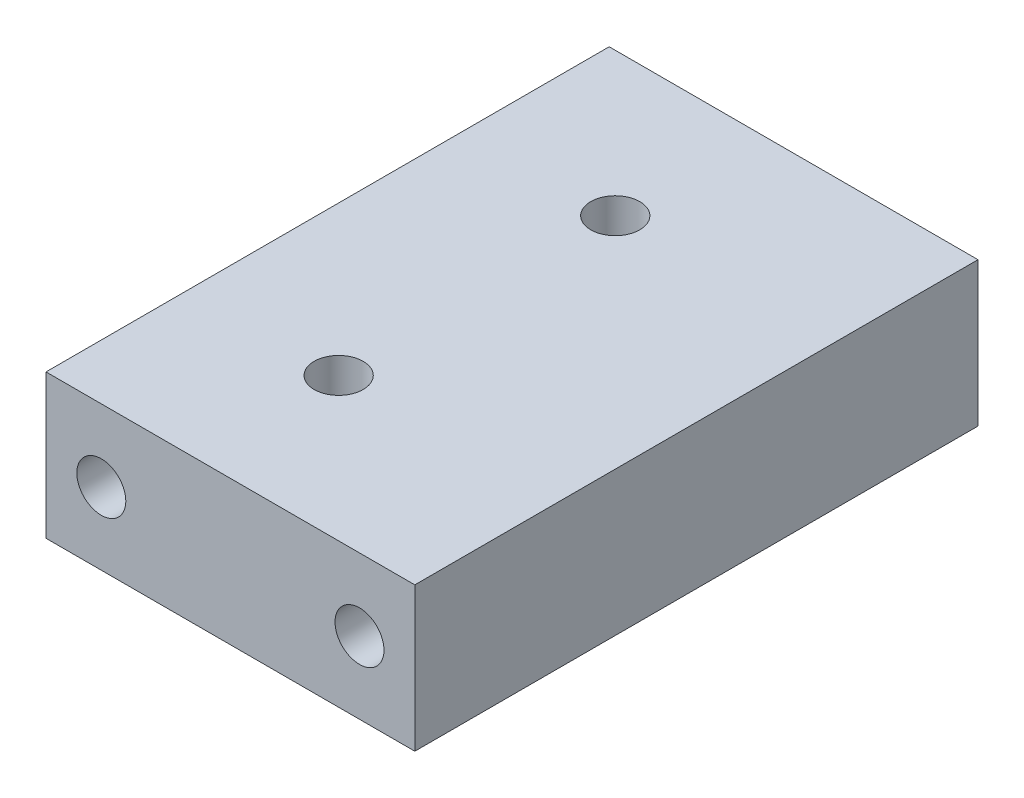
ISO-10303-21;
HEADER;
FILE_DESCRIPTION(('STEP AP214'),'2;1');
FILE_NAME('part.step','',(''),(''),'','','');
FILE_SCHEMA(('AUTOMOTIVE_DESIGN { 1 0 10303 214 1 1 1 1 }'));
ENDSEC;
DATA;
#1=APPLICATION_CONTEXT('core data for automotive mechanical design processes');
#2=APPLICATION_PROTOCOL_DEFINITION('international standard','automotive_design',2000,#1);
#3=PRODUCT_CONTEXT('',#1,'mechanical');
#4=PRODUCT('Part','Part','',(#3));
#5=PRODUCT_RELATED_PRODUCT_CATEGORY('part','',(#4));
#6=PRODUCT_DEFINITION_FORMATION('','',#4);
#7=PRODUCT_DEFINITION_CONTEXT('part definition',#1,'design');
#8=PRODUCT_DEFINITION('design','',#6,#7);
#9=PRODUCT_DEFINITION_SHAPE('','',#8);
#10=(LENGTH_UNIT() NAMED_UNIT(*) SI_UNIT(.MILLI.,.METRE.));
#11=(NAMED_UNIT(*) PLANE_ANGLE_UNIT() SI_UNIT($,.RADIAN.));
#12=(NAMED_UNIT(*) SI_UNIT($,.STERADIAN.) SOLID_ANGLE_UNIT());
#13=UNCERTAINTY_MEASURE_WITH_UNIT(LENGTH_MEASURE(1.E-05),#10,'distance_accuracy_value','');
#14=(GEOMETRIC_REPRESENTATION_CONTEXT(3) GLOBAL_UNCERTAINTY_ASSIGNED_CONTEXT((#13)) GLOBAL_UNIT_ASSIGNED_CONTEXT((#10,
#11,#12)) REPRESENTATION_CONTEXT('',''));
#15=CARTESIAN_POINT('',(0.,0.,0.));
#16=DIRECTION('',(0.,0.,1.));
#17=DIRECTION('',(1.,0.,0.));
#18=AXIS2_PLACEMENT_3D('',#15,#16,#17);
#19=CARTESIAN_POINT('',(0.,19.8501,0.));
#20=DIRECTION('',(1.,0.,0.));
#21=DIRECTION('',(0.,0.,-1.));
#22=AXIS2_PLACEMENT_3D('',#19,#20,#21);
#23=PLANE('',#22);
#24=DIRECTION('',(0.,0.,1.));
#25=VECTOR('',#24,1.);
#26=CARTESIAN_POINT('',(0.,0.,0.));
#27=LINE('',#26,#25);
#28=CARTESIAN_POINT('',(0.,0.,-77.5716));
#29=VERTEX_POINT('',#28);
#30=CARTESIAN_POINT('',(0.,0.,0.));
#31=VERTEX_POINT('',#30);
#32=EDGE_CURVE('E95',#29,#31,#27,.T.);
#33=ORIENTED_EDGE('',*,*,#32,.T.);
#34=DIRECTION('',(0.,-1.,0.));
#35=VECTOR('',#34,1.);
#36=CARTESIAN_POINT('',(0.,19.8501,0.));
#37=LINE('',#36,#35);
#38=CARTESIAN_POINT('',(0.,19.8501,0.));
#39=VERTEX_POINT('',#38);
#40=EDGE_CURVE('E11',#39,#31,#37,.T.);
#41=ORIENTED_EDGE('',*,*,#40,.F.);
#42=DIRECTION('',(0.,0.,1.));
#43=VECTOR('',#42,1.);
#44=CARTESIAN_POINT('',(0.,19.8501,0.));
#45=LINE('',#44,#43);
#46=CARTESIAN_POINT('',(0.,19.8501,-77.5716));
#47=VERTEX_POINT('',#46);
#48=EDGE_CURVE('E83',#47,#39,#45,.T.);
#49=ORIENTED_EDGE('',*,*,#48,.F.);
#50=DIRECTION('',(0.,-1.,0.));
#51=VECTOR('',#50,1.);
#52=CARTESIAN_POINT('',(0.,19.8501,-77.5716));
#53=LINE('',#52,#51);
#54=EDGE_CURVE('E91',#47,#29,#53,.T.);
#55=ORIENTED_EDGE('',*,*,#54,.T.);
#56=EDGE_LOOP('',(#33,#41,#49,#55));
#57=FACE_BOUND('',#56,.T.);
#58=ADVANCED_FACE('F32',(#57),#23,.F.);
#59=CARTESIAN_POINT('',(0.,19.8501,0.));
#60=DIRECTION('',(0.,0.,-1.));
#61=DIRECTION('',(-1.,0.,0.));
#62=AXIS2_PLACEMENT_3D('',#59,#60,#61);
#63=PLANE('',#62);
#64=CARTESIAN_POINT('',(43.18,9.92505,0.));
#65=DIRECTION('',(0.,0.,1.));
#66=DIRECTION('',(1.,0.,0.));
#67=AXIS2_PLACEMENT_3D('',#64,#65,#66);
#68=CIRCLE('',#67,3.3734375);
#69=CARTESIAN_POINT('',(46.5534375,9.92505,0.));
#70=VERTEX_POINT('',#69);
#71=EDGE_CURVE('E127',#70,#70,#68,.T.);
#72=ORIENTED_EDGE('',*,*,#71,.F.);
#73=EDGE_LOOP('',(#72));
#74=FACE_BOUND('',#73,.T.);
#75=CARTESIAN_POINT('',(7.62,9.92505,0.));
#76=DIRECTION('',(0.,0.,1.));
#77=DIRECTION('',(1.,0.,0.));
#78=AXIS2_PLACEMENT_3D('',#75,#76,#77);
#79=CIRCLE('',#78,3.3734375);
#80=CARTESIAN_POINT('',(10.9934375,9.92505,0.));
#81=VERTEX_POINT('',#80);
#82=EDGE_CURVE('E121',#81,#81,#79,.T.);
#83=ORIENTED_EDGE('',*,*,#82,.F.);
#84=EDGE_LOOP('',(#83));
#85=FACE_BOUND('',#84,.T.);
#86=DIRECTION('',(1.,0.,0.));
#87=VECTOR('',#86,1.);
#88=CARTESIAN_POINT('',(0.,0.,0.));
#89=LINE('',#88,#87);
#90=CARTESIAN_POINT('',(50.8,0.,0.));
#91=VERTEX_POINT('',#90);
#92=EDGE_CURVE('E87',#31,#91,#89,.T.);
#93=ORIENTED_EDGE('',*,*,#92,.T.);
#94=DIRECTION('',(0.,-1.,0.));
#95=VECTOR('',#94,1.);
#96=CARTESIAN_POINT('',(50.8,19.8501,0.));
#97=LINE('',#96,#95);
#98=CARTESIAN_POINT('',(50.8,19.8501,0.));
#99=VERTEX_POINT('',#98);
#100=EDGE_CURVE('E40',#99,#91,#97,.T.);
#101=ORIENTED_EDGE('',*,*,#100,.F.);
#102=DIRECTION('',(1.,0.,0.));
#103=VECTOR('',#102,1.);
#104=CARTESIAN_POINT('',(0.,19.8501,0.));
#105=LINE('',#104,#103);
#106=EDGE_CURVE('E78',#39,#99,#105,.T.);
#107=ORIENTED_EDGE('',*,*,#106,.F.);
#108=ORIENTED_EDGE('',*,*,#40,.T.);
#109=EDGE_LOOP('',(#93,#101,#107,#108));
#110=FACE_BOUND('',#109,.T.);
#111=ADVANCED_FACE('F86',(#74,#85,#110),#63,.F.);
#112=CARTESIAN_POINT('',(50.8,19.8501,0.));
#113=DIRECTION('',(-1.,0.,0.));
#114=DIRECTION('',(0.,0.,1.));
#115=AXIS2_PLACEMENT_3D('',#112,#113,#114);
#116=PLANE('',#115);
#117=DIRECTION('',(0.,0.,-1.));
#118=VECTOR('',#117,1.);
#119=CARTESIAN_POINT('',(50.8,0.,0.));
#120=LINE('',#119,#118);
#121=CARTESIAN_POINT('',(50.8,0.,-77.5716));
#122=VERTEX_POINT('',#121);
#123=EDGE_CURVE('E65',#91,#122,#120,.T.);
#124=ORIENTED_EDGE('',*,*,#123,.T.);
#125=DIRECTION('',(0.,-1.,0.));
#126=VECTOR('',#125,1.);
#127=CARTESIAN_POINT('',(50.8,19.8501,-77.5716));
#128=LINE('',#127,#126);
#129=CARTESIAN_POINT('',(50.8,19.8501,-77.5716));
#130=VERTEX_POINT('',#129);
#131=EDGE_CURVE('E88',#130,#122,#128,.T.);
#132=ORIENTED_EDGE('',*,*,#131,.F.);
#133=DIRECTION('',(0.,0.,-1.));
#134=VECTOR('',#133,1.);
#135=CARTESIAN_POINT('',(50.8,19.8501,0.));
#136=LINE('',#135,#134);
#137=EDGE_CURVE('E81',#99,#130,#136,.T.);
#138=ORIENTED_EDGE('',*,*,#137,.F.);
#139=ORIENTED_EDGE('',*,*,#100,.T.);
#140=EDGE_LOOP('',(#124,#132,#138,#139));
#141=FACE_BOUND('',#140,.T.);
#142=ADVANCED_FACE('F89',(#141),#116,.F.);
#143=CARTESIAN_POINT('',(0.,19.8501,-77.5716));
#144=DIRECTION('',(0.,0.,1.));
#145=DIRECTION('',(1.,0.,0.));
#146=AXIS2_PLACEMENT_3D('',#143,#144,#145);
#147=PLANE('',#146);
#148=CARTESIAN_POINT('',(43.18,9.92505,-77.5716));
#149=DIRECTION('',(0.,0.,1.));
#150=DIRECTION('',(1.,0.,0.));
#151=AXIS2_PLACEMENT_3D('',#148,#149,#150);
#152=CIRCLE('',#151,3.3734375);
#153=CARTESIAN_POINT('',(46.5534375,9.92505,-77.5716));
#154=VERTEX_POINT('',#153);
#155=EDGE_CURVE('E124',#154,#154,#152,.T.);
#156=ORIENTED_EDGE('',*,*,#155,.T.);
#157=EDGE_LOOP('',(#156));
#158=FACE_BOUND('',#157,.T.);
#159=CARTESIAN_POINT('',(7.62,9.92505,-77.5716));
#160=DIRECTION('',(0.,0.,1.));
#161=DIRECTION('',(1.,0.,0.));
#162=AXIS2_PLACEMENT_3D('',#159,#160,#161);
#163=CIRCLE('',#162,3.3734375);
#164=CARTESIAN_POINT('',(10.9934375,9.92505,-77.5716));
#165=VERTEX_POINT('',#164);
#166=EDGE_CURVE('E118',#165,#165,#163,.T.);
#167=ORIENTED_EDGE('',*,*,#166,.T.);
#168=EDGE_LOOP('',(#167));
#169=FACE_BOUND('',#168,.T.);
#170=DIRECTION('',(-1.,0.,0.));
#171=VECTOR('',#170,1.);
#172=CARTESIAN_POINT('',(0.,0.,-77.5716));
#173=LINE('',#172,#171);
#174=EDGE_CURVE('E71',#122,#29,#173,.T.);
#175=ORIENTED_EDGE('',*,*,#174,.T.);
#176=ORIENTED_EDGE('',*,*,#54,.F.);
#177=DIRECTION('',(-1.,0.,0.));
#178=VECTOR('',#177,1.);
#179=CARTESIAN_POINT('',(0.,19.8501,-77.5716));
#180=LINE('',#179,#178);
#181=EDGE_CURVE('E48',#130,#47,#180,.T.);
#182=ORIENTED_EDGE('',*,*,#181,.F.);
#183=ORIENTED_EDGE('',*,*,#131,.T.);
#184=EDGE_LOOP('',(#175,#176,#182,#183));
#185=FACE_BOUND('',#184,.T.);
#186=ADVANCED_FACE('F103',(#158,#169,#185),#147,.F.);
#187=CARTESIAN_POINT('',(0.,19.8501,0.));
#188=DIRECTION('',(0.,-1.,0.));
#189=DIRECTION('',(0.,0.,-1.));
#190=AXIS2_PLACEMENT_3D('',#187,#188,#189);
#191=PLANE('',#190);
#192=CARTESIAN_POINT('',(20.574000000001,19.8501,-57.8358000152037));
#193=DIRECTION('',(0.,1.,0.));
#194=DIRECTION('',(0.,0.,1.));
#195=AXIS2_PLACEMENT_3D('',#192,#193,#194);
#196=CIRCLE('',#195,3.3734375);
#197=CARTESIAN_POINT('',(20.574000000001,19.8501,-54.4623625152037));
#198=VERTEX_POINT('',#197);
#199=EDGE_CURVE('E115',#198,#198,#196,.T.);
#200=ORIENTED_EDGE('',*,*,#199,.F.);
#201=EDGE_LOOP('',(#200));
#202=FACE_BOUND('',#201,.T.);
#203=CARTESIAN_POINT('',(20.574000000001,19.8501,-19.7358000152037));
#204=DIRECTION('',(0.,1.,0.));
#205=DIRECTION('',(0.,0.,1.));
#206=AXIS2_PLACEMENT_3D('',#203,#204,#205);
#207=CIRCLE('',#206,3.3734375);
#208=CARTESIAN_POINT('',(20.574000000001,19.8501,-16.3623625152037));
#209=VERTEX_POINT('',#208);
#210=EDGE_CURVE('E109',#209,#209,#207,.T.);
#211=ORIENTED_EDGE('',*,*,#210,.F.);
#212=EDGE_LOOP('',(#211));
#213=FACE_BOUND('',#212,.T.);
#214=ORIENTED_EDGE('',*,*,#48,.T.);
#215=ORIENTED_EDGE('',*,*,#106,.T.);
#216=ORIENTED_EDGE('',*,*,#137,.T.);
#217=ORIENTED_EDGE('',*,*,#181,.T.);
#218=EDGE_LOOP('',(#214,#215,#216,#217));
#219=FACE_BOUND('',#218,.T.);
#220=ADVANCED_FACE('F79',(#202,#213,#219),#191,.F.);
#221=CARTESIAN_POINT('',(0.,0.,0.));
#222=DIRECTION('',(0.,-1.,0.));
#223=DIRECTION('',(0.,0.,-1.));
#224=AXIS2_PLACEMENT_3D('',#221,#222,#223);
#225=PLANE('',#224);
#226=CARTESIAN_POINT('',(20.574000000001,0.,-57.8358000152037));
#227=DIRECTION('',(0.,1.,0.));
#228=DIRECTION('',(0.,0.,1.));
#229=AXIS2_PLACEMENT_3D('',#226,#227,#228);
#230=CIRCLE('',#229,3.3734375);
#231=CARTESIAN_POINT('',(20.574000000001,0.,-54.4623625152037));
#232=VERTEX_POINT('',#231);
#233=EDGE_CURVE('E112',#232,#232,#230,.T.);
#234=ORIENTED_EDGE('',*,*,#233,.T.);
#235=EDGE_LOOP('',(#234));
#236=FACE_BOUND('',#235,.T.);
#237=CARTESIAN_POINT('',(20.574000000001,0.,-19.7358000152037));
#238=DIRECTION('',(0.,1.,0.));
#239=DIRECTION('',(0.,0.,1.));
#240=AXIS2_PLACEMENT_3D('',#237,#238,#239);
#241=CIRCLE('',#240,3.3734375);
#242=CARTESIAN_POINT('',(20.574000000001,0.,-16.3623625152037));
#243=VERTEX_POINT('',#242);
#244=EDGE_CURVE('E98',#243,#243,#241,.T.);
#245=ORIENTED_EDGE('',*,*,#244,.T.);
#246=EDGE_LOOP('',(#245));
#247=FACE_BOUND('',#246,.T.);
#248=ORIENTED_EDGE('',*,*,#32,.F.);
#249=ORIENTED_EDGE('',*,*,#174,.F.);
#250=ORIENTED_EDGE('',*,*,#123,.F.);
#251=ORIENTED_EDGE('',*,*,#92,.F.);
#252=EDGE_LOOP('',(#248,#249,#250,#251));
#253=FACE_BOUND('',#252,.T.);
#254=ADVANCED_FACE('F106',(#236,#247,#253),#225,.T.);
#255=CARTESIAN_POINT('',(20.574000000001,0.,-19.7358000152037));
#256=DIRECTION('',(0.,1.,0.));
#257=DIRECTION('',(0.,0.,1.));
#258=AXIS2_PLACEMENT_3D('',#255,#256,#257);
#259=CYLINDRICAL_SURFACE('',#258,3.3734375);
#260=CARTESIAN_POINT('',(20.574000000001,0.,-16.3623625152037));
#261=CARTESIAN_POINT('',(20.574000000001,0.206771875,-16.3623625152037));
#262=CARTESIAN_POINT('',(20.574000000001,0.41354375,-16.3623625152037));
#263=CARTESIAN_POINT('',(20.574000000001,0.8270875,-16.3623625152037));
#264=CARTESIAN_POINT('',(20.574000000001,1.033859375,-16.3623625152037));
#265=CARTESIAN_POINT('',(20.574000000001,1.447403125,-16.3623625152037));
#266=CARTESIAN_POINT('',(20.574000000001,1.654175,-16.3623625152037));
#267=CARTESIAN_POINT('',(20.574000000001,2.06771875,-16.3623625152037));
#268=CARTESIAN_POINT('',(20.574000000001,2.274490625,-16.3623625152037));
#269=CARTESIAN_POINT('',(20.574000000001,2.688034375,-16.3623625152037));
#270=CARTESIAN_POINT('',(20.574000000001,2.89480625,-16.3623625152037));
#271=CARTESIAN_POINT('',(20.574000000001,3.30835,-16.3623625152037));
#272=CARTESIAN_POINT('',(20.574000000001,3.515121875,-16.3623625152037));
#273=CARTESIAN_POINT('',(20.574000000001,3.928665625,-16.3623625152037));
#274=CARTESIAN_POINT('',(20.574000000001,4.1354375,-16.3623625152037));
#275=CARTESIAN_POINT('',(20.574000000001,4.54898125,-16.3623625152037));
#276=CARTESIAN_POINT('',(20.574000000001,4.755753125,-16.3623625152037));
#277=CARTESIAN_POINT('',(20.574000000001,5.169296875,-16.3623625152037));
#278=CARTESIAN_POINT('',(20.574000000001,5.37606875,-16.3623625152037));
#279=CARTESIAN_POINT('',(20.574000000001,5.7896125,-16.3623625152037));
#280=CARTESIAN_POINT('',(20.574000000001,5.996384375,-16.3623625152037));
#281=CARTESIAN_POINT('',(20.574000000001,6.409928125,-16.3623625152037));
#282=CARTESIAN_POINT('',(20.574000000001,6.6167,-16.3623625152037));
#283=CARTESIAN_POINT('',(20.574000000001,7.03024375,-16.3623625152037));
#284=CARTESIAN_POINT('',(20.574000000001,7.237015625,-16.3623625152037));
#285=CARTESIAN_POINT('',(20.574000000001,7.650559375,-16.3623625152037));
#286=CARTESIAN_POINT('',(20.574000000001,7.85733125,-16.3623625152037));
#287=CARTESIAN_POINT('',(20.574000000001,8.270875,-16.3623625152037));
#288=CARTESIAN_POINT('',(20.574000000001,8.477646875,-16.3623625152037));
#289=CARTESIAN_POINT('',(20.574000000001,8.891190625,-16.3623625152037));
#290=CARTESIAN_POINT('',(20.574000000001,9.0979625,-16.3623625152037));
#291=CARTESIAN_POINT('',(20.574000000001,9.51150625,-16.3623625152037));
#292=CARTESIAN_POINT('',(20.574000000001,9.718278125,-16.3623625152037));
#293=CARTESIAN_POINT('',(20.574000000001,10.131821875,-16.3623625152037));
#294=CARTESIAN_POINT('',(20.574000000001,10.33859375,-16.3623625152037));
#295=CARTESIAN_POINT('',(20.574000000001,10.7521375,-16.3623625152037));
#296=CARTESIAN_POINT('',(20.574000000001,10.958909375,-16.3623625152037));
#297=CARTESIAN_POINT('',(20.574000000001,11.372453125,-16.3623625152037));
#298=CARTESIAN_POINT('',(20.574000000001,11.579225,-16.3623625152037));
#299=CARTESIAN_POINT('',(20.574000000001,11.99276875,-16.3623625152037));
#300=CARTESIAN_POINT('',(20.574000000001,12.199540625,-16.3623625152037));
#301=CARTESIAN_POINT('',(20.574000000001,12.613084375,-16.3623625152037));
#302=CARTESIAN_POINT('',(20.574000000001,12.81985625,-16.3623625152037));
#303=CARTESIAN_POINT('',(20.574000000001,13.2334,-16.3623625152037));
#304=CARTESIAN_POINT('',(20.574000000001,13.440171875,-16.3623625152037));
#305=CARTESIAN_POINT('',(20.574000000001,13.853715625,-16.3623625152037));
#306=CARTESIAN_POINT('',(20.574000000001,14.0604875,-16.3623625152037));
#307=CARTESIAN_POINT('',(20.574000000001,14.47403125,-16.3623625152037));
#308=CARTESIAN_POINT('',(20.574000000001,14.680803125,-16.3623625152037));
#309=CARTESIAN_POINT('',(20.574000000001,15.094346875,-16.3623625152037));
#310=CARTESIAN_POINT('',(20.574000000001,15.30111875,-16.3623625152037));
#311=CARTESIAN_POINT('',(20.574000000001,15.7146625,-16.3623625152037));
#312=CARTESIAN_POINT('',(20.574000000001,15.921434375,-16.3623625152037));
#313=CARTESIAN_POINT('',(20.574000000001,16.334978125,-16.3623625152037));
#314=CARTESIAN_POINT('',(20.574000000001,16.54175,-16.3623625152037));
#315=CARTESIAN_POINT('',(20.574000000001,16.95529375,-16.3623625152037));
#316=CARTESIAN_POINT('',(20.574000000001,17.162065625,-16.3623625152037));
#317=CARTESIAN_POINT('',(20.574000000001,17.575609375,-16.3623625152037));
#318=CARTESIAN_POINT('',(20.574000000001,17.78238125,-16.3623625152037));
#319=CARTESIAN_POINT('',(20.574000000001,18.195925,-16.3623625152037));
#320=CARTESIAN_POINT('',(20.574000000001,18.402696875,-16.3623625152037));
#321=CARTESIAN_POINT('',(20.574000000001,18.816240625,-16.3623625152037));
#322=CARTESIAN_POINT('',(20.574000000001,19.0230125,-16.3623625152037));
#323=CARTESIAN_POINT('',(20.574000000001,19.43655625,-16.3623625152037));
#324=CARTESIAN_POINT('',(20.574000000001,19.643328125,-16.3623625152037));
#325=CARTESIAN_POINT('',(20.574000000001,19.8501,-16.3623625152037));
#326=B_SPLINE_CURVE_WITH_KNOTS('',3,(#260,#261,#262,#263,#264,#265,#266,#267,#268,#269,#270,
#271,#272,#273,#274,#275,#276,#277,#278,#279,#280,#281,#282,#283,#284,#285,#286,#287,#288,#289,
#290,#291,#292,#293,#294,#295,#296,#297,#298,#299,#300,#301,#302,#303,#304,#305,#306,#307,#308,
#309,#310,#311,#312,#313,#314,#315,#316,#317,#318,#319,#320,#321,#322,#323,#324,#325),
.UNSPECIFIED.,.F.,.F.,(4,2,2,2,2,2,2,2,2,2,2,2,2,2,2,2,2,2,2,2,2,2,2,2,2,2,2,2,2,2,2,2,4),(0.,
0.620315625,1.24063125,1.860946875,2.4812625,3.101578125,3.72189375,4.342209375,4.962525,
5.582840625,6.20315625,6.823471875,7.4437875,8.064103125,8.68441875,9.304734375,9.92505,
10.545365625,11.16568125,11.785996875,12.4063125,13.026628125,13.64694375,14.267259375,
14.887575,15.507890625,16.12820625,16.748521875,17.3688375,17.989153125,18.60946875,
19.229784375,19.8501),.UNSPECIFIED.);
#327=EDGE_CURVE('BSEAM153',#243,#209,#326,.T.);
#328=ORIENTED_EDGE('',*,*,#244,.F.);
#329=ORIENTED_EDGE('',*,*,#210,.T.);
#330=ORIENTED_EDGE('',*,*,#327,.T.);
#331=ORIENTED_EDGE('',*,*,#327,.F.);
#332=EDGE_LOOP('',(#328,#330,#329,#331));
#333=FACE_BOUND('',#332,.T.);
#334=ADVANCED_FACE('F153',(#333),#259,.F.);
#335=CARTESIAN_POINT('',(20.574000000001,0.,-57.8358000152037));
#336=DIRECTION('',(0.,1.,0.));
#337=DIRECTION('',(0.,0.,1.));
#338=AXIS2_PLACEMENT_3D('',#335,#336,#337);
#339=CYLINDRICAL_SURFACE('',#338,3.3734375);
#340=CARTESIAN_POINT('',(20.574000000001,0.,-54.4623625152037));
#341=CARTESIAN_POINT('',(20.574000000001,0.206771875,-54.4623625152037));
#342=CARTESIAN_POINT('',(20.574000000001,0.41354375,-54.4623625152037));
#343=CARTESIAN_POINT('',(20.574000000001,0.8270875,-54.4623625152037));
#344=CARTESIAN_POINT('',(20.574000000001,1.033859375,-54.4623625152037));
#345=CARTESIAN_POINT('',(20.574000000001,1.447403125,-54.4623625152037));
#346=CARTESIAN_POINT('',(20.574000000001,1.654175,-54.4623625152037));
#347=CARTESIAN_POINT('',(20.574000000001,2.06771875,-54.4623625152037));
#348=CARTESIAN_POINT('',(20.574000000001,2.274490625,-54.4623625152037));
#349=CARTESIAN_POINT('',(20.574000000001,2.688034375,-54.4623625152037));
#350=CARTESIAN_POINT('',(20.574000000001,2.89480625,-54.4623625152037));
#351=CARTESIAN_POINT('',(20.574000000001,3.30835,-54.4623625152037));
#352=CARTESIAN_POINT('',(20.574000000001,3.515121875,-54.4623625152037));
#353=CARTESIAN_POINT('',(20.574000000001,3.928665625,-54.4623625152037));
#354=CARTESIAN_POINT('',(20.574000000001,4.1354375,-54.4623625152037));
#355=CARTESIAN_POINT('',(20.574000000001,4.54898125,-54.4623625152037));
#356=CARTESIAN_POINT('',(20.574000000001,4.755753125,-54.4623625152037));
#357=CARTESIAN_POINT('',(20.574000000001,5.169296875,-54.4623625152037));
#358=CARTESIAN_POINT('',(20.574000000001,5.37606875,-54.4623625152037));
#359=CARTESIAN_POINT('',(20.574000000001,5.7896125,-54.4623625152037));
#360=CARTESIAN_POINT('',(20.574000000001,5.996384375,-54.4623625152037));
#361=CARTESIAN_POINT('',(20.574000000001,6.409928125,-54.4623625152037));
#362=CARTESIAN_POINT('',(20.574000000001,6.6167,-54.4623625152037));
#363=CARTESIAN_POINT('',(20.574000000001,7.03024375,-54.4623625152037));
#364=CARTESIAN_POINT('',(20.574000000001,7.237015625,-54.4623625152037));
#365=CARTESIAN_POINT('',(20.574000000001,7.650559375,-54.4623625152037));
#366=CARTESIAN_POINT('',(20.574000000001,7.85733125,-54.4623625152037));
#367=CARTESIAN_POINT('',(20.574000000001,8.270875,-54.4623625152037));
#368=CARTESIAN_POINT('',(20.574000000001,8.477646875,-54.4623625152037));
#369=CARTESIAN_POINT('',(20.574000000001,8.891190625,-54.4623625152037));
#370=CARTESIAN_POINT('',(20.574000000001,9.0979625,-54.4623625152037));
#371=CARTESIAN_POINT('',(20.574000000001,9.51150625,-54.4623625152037));
#372=CARTESIAN_POINT('',(20.574000000001,9.718278125,-54.4623625152037));
#373=CARTESIAN_POINT('',(20.574000000001,10.131821875,-54.4623625152037));
#374=CARTESIAN_POINT('',(20.574000000001,10.33859375,-54.4623625152037));
#375=CARTESIAN_POINT('',(20.574000000001,10.7521375,-54.4623625152037));
#376=CARTESIAN_POINT('',(20.574000000001,10.958909375,-54.4623625152037));
#377=CARTESIAN_POINT('',(20.574000000001,11.372453125,-54.4623625152037));
#378=CARTESIAN_POINT('',(20.574000000001,11.579225,-54.4623625152037));
#379=CARTESIAN_POINT('',(20.574000000001,11.99276875,-54.4623625152037));
#380=CARTESIAN_POINT('',(20.574000000001,12.199540625,-54.4623625152037));
#381=CARTESIAN_POINT('',(20.574000000001,12.613084375,-54.4623625152037));
#382=CARTESIAN_POINT('',(20.574000000001,12.81985625,-54.4623625152037));
#383=CARTESIAN_POINT('',(20.574000000001,13.2334,-54.4623625152037));
#384=CARTESIAN_POINT('',(20.574000000001,13.440171875,-54.4623625152037));
#385=CARTESIAN_POINT('',(20.574000000001,13.853715625,-54.4623625152037));
#386=CARTESIAN_POINT('',(20.574000000001,14.0604875,-54.4623625152037));
#387=CARTESIAN_POINT('',(20.574000000001,14.47403125,-54.4623625152037));
#388=CARTESIAN_POINT('',(20.574000000001,14.680803125,-54.4623625152037));
#389=CARTESIAN_POINT('',(20.574000000001,15.094346875,-54.4623625152037));
#390=CARTESIAN_POINT('',(20.574000000001,15.30111875,-54.4623625152037));
#391=CARTESIAN_POINT('',(20.574000000001,15.7146625,-54.4623625152037));
#392=CARTESIAN_POINT('',(20.574000000001,15.921434375,-54.4623625152037));
#393=CARTESIAN_POINT('',(20.574000000001,16.334978125,-54.4623625152037));
#394=CARTESIAN_POINT('',(20.574000000001,16.54175,-54.4623625152037));
#395=CARTESIAN_POINT('',(20.574000000001,16.95529375,-54.4623625152037));
#396=CARTESIAN_POINT('',(20.574000000001,17.162065625,-54.4623625152037));
#397=CARTESIAN_POINT('',(20.574000000001,17.575609375,-54.4623625152037));
#398=CARTESIAN_POINT('',(20.574000000001,17.78238125,-54.4623625152037));
#399=CARTESIAN_POINT('',(20.574000000001,18.195925,-54.4623625152037));
#400=CARTESIAN_POINT('',(20.574000000001,18.402696875,-54.4623625152037));
#401=CARTESIAN_POINT('',(20.574000000001,18.816240625,-54.4623625152037));
#402=CARTESIAN_POINT('',(20.574000000001,19.0230125,-54.4623625152037));
#403=CARTESIAN_POINT('',(20.574000000001,19.43655625,-54.4623625152037));
#404=CARTESIAN_POINT('',(20.574000000001,19.643328125,-54.4623625152037));
#405=CARTESIAN_POINT('',(20.574000000001,19.8501,-54.4623625152037));
#406=B_SPLINE_CURVE_WITH_KNOTS('',3,(#340,#341,#342,#343,#344,#345,#346,#347,#348,#349,#350,
#351,#352,#353,#354,#355,#356,#357,#358,#359,#360,#361,#362,#363,#364,#365,#366,#367,#368,#369,
#370,#371,#372,#373,#374,#375,#376,#377,#378,#379,#380,#381,#382,#383,#384,#385,#386,#387,#388,
#389,#390,#391,#392,#393,#394,#395,#396,#397,#398,#399,#400,#401,#402,#403,#404,#405),
.UNSPECIFIED.,.F.,.F.,(4,2,2,2,2,2,2,2,2,2,2,2,2,2,2,2,2,2,2,2,2,2,2,2,2,2,2,2,2,2,2,2,4),(0.,
0.620315625,1.24063125,1.860946875,2.4812625,3.101578125,3.72189375,4.342209375,4.962525,
5.582840625,6.20315625,6.823471875,7.4437875,8.064103125,8.68441875,9.304734375,9.92505,
10.545365625,11.16568125,11.785996875,12.4063125,13.026628125,13.64694375,14.267259375,
14.887575,15.507890625,16.12820625,16.748521875,17.3688375,17.989153125,18.60946875,
19.229784375,19.8501),.UNSPECIFIED.);
#407=EDGE_CURVE('BSEAM147',#232,#198,#406,.T.);
#408=ORIENTED_EDGE('',*,*,#233,.F.);
#409=ORIENTED_EDGE('',*,*,#199,.T.);
#410=ORIENTED_EDGE('',*,*,#407,.T.);
#411=ORIENTED_EDGE('',*,*,#407,.F.);
#412=EDGE_LOOP('',(#408,#410,#409,#411));
#413=FACE_BOUND('',#412,.T.);
#414=ADVANCED_FACE('F147',(#413),#339,.F.);
#415=CARTESIAN_POINT('',(7.62,9.92505,-77.5716));
#416=DIRECTION('',(0.,0.,1.));
#417=DIRECTION('',(1.,0.,0.));
#418=AXIS2_PLACEMENT_3D('',#415,#416,#417);
#419=CYLINDRICAL_SURFACE('',#418,3.3734375);
#420=ORIENTED_EDGE('',*,*,#166,.F.);
#421=EDGE_LOOP('',(#420));
#422=FACE_BOUND('',#421,.T.);
#423=ORIENTED_EDGE('',*,*,#82,.T.);
#424=EDGE_LOOP('',(#423));
#425=FACE_BOUND('',#424,.T.);
#426=ADVANCED_FACE('F138',(#422,#425),#419,.F.);
#427=CARTESIAN_POINT('',(43.18,9.92505,-77.5716));
#428=DIRECTION('',(0.,0.,1.));
#429=DIRECTION('',(1.,0.,0.));
#430=AXIS2_PLACEMENT_3D('',#427,#428,#429);
#431=CYLINDRICAL_SURFACE('',#430,3.3734375);
#432=ORIENTED_EDGE('',*,*,#155,.F.);
#433=EDGE_LOOP('',(#432));
#434=FACE_BOUND('',#433,.T.);
#435=ORIENTED_EDGE('',*,*,#71,.T.);
#436=EDGE_LOOP('',(#435));
#437=FACE_BOUND('',#436,.T.);
#438=ADVANCED_FACE('F135',(#434,#437),#431,.F.);
#439=CLOSED_SHELL('',(#58,#111,#142,#186,#220,#254,#334,#414,#426,#438));
#440=MANIFOLD_SOLID_BREP('B2',#439);
#441=ADVANCED_BREP_SHAPE_REPRESENTATION('',(#18,#440),#14);
#442=SHAPE_DEFINITION_REPRESENTATION(#9,#441);
ENDSEC;
END-ISO-10303-21;
